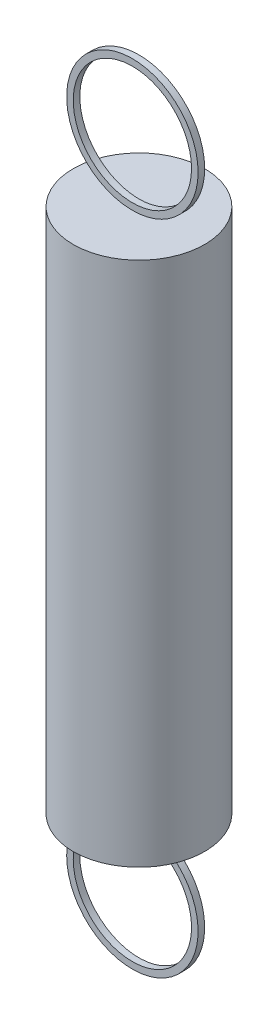
ISO-10303-21;
HEADER;
FILE_DESCRIPTION(('STEP AP214'),'2;1');
FILE_NAME('part.step','',(''),(''),'','','');
FILE_SCHEMA(('AUTOMOTIVE_DESIGN { 1 0 10303 214 1 1 1 1 }'));
ENDSEC;
DATA;
#1=APPLICATION_CONTEXT('core data for automotive mechanical design processes');
#2=APPLICATION_PROTOCOL_DEFINITION('international standard','automotive_design',2000,#1);
#3=PRODUCT_CONTEXT('',#1,'mechanical');
#4=PRODUCT('Part','Part','',(#3));
#5=PRODUCT_RELATED_PRODUCT_CATEGORY('part','',(#4));
#6=PRODUCT_DEFINITION_FORMATION('','',#4);
#7=PRODUCT_DEFINITION_CONTEXT('part definition',#1,'design');
#8=PRODUCT_DEFINITION('design','',#6,#7);
#9=PRODUCT_DEFINITION_SHAPE('','',#8);
#10=(LENGTH_UNIT() NAMED_UNIT(*) SI_UNIT(.MILLI.,.METRE.));
#11=(NAMED_UNIT(*) PLANE_ANGLE_UNIT() SI_UNIT($,.RADIAN.));
#12=(NAMED_UNIT(*) SI_UNIT($,.STERADIAN.) SOLID_ANGLE_UNIT());
#13=UNCERTAINTY_MEASURE_WITH_UNIT(LENGTH_MEASURE(1.E-05),#10,'distance_accuracy_value','');
#14=(GEOMETRIC_REPRESENTATION_CONTEXT(3) GLOBAL_UNCERTAINTY_ASSIGNED_CONTEXT((#13)) GLOBAL_UNIT_ASSIGNED_CONTEXT((#10,
#11,#12)) REPRESENTATION_CONTEXT('',''));
#15=CARTESIAN_POINT('',(0.,0.,0.));
#16=DIRECTION('',(0.,0.,1.));
#17=DIRECTION('',(1.,0.,0.));
#18=AXIS2_PLACEMENT_3D('',#15,#16,#17);
#19=CARTESIAN_POINT('',(0.,-5.,0.5));
#20=DIRECTION('',(0.,0.,-1.));
#21=DIRECTION('',(-1.,0.,0.));
#22=AXIS2_PLACEMENT_3D('',#19,#20,#21);
#23=PLANE('',#22);
#24=CARTESIAN_POINT('',(0.,-5.,0.5));
#25=DIRECTION('',(0.,0.,1.));
#26=DIRECTION('',(-1.,0.,0.));
#27=AXIS2_PLACEMENT_3D('',#24,#25,#26);
#28=CIRCLE('',#27,5.);
#29=CARTESIAN_POINT('',(-5.,-5.,0.5));
#30=VERTEX_POINT('',#29);
#31=EDGE_CURVE('E59',#30,#30,#28,.T.);
#32=ORIENTED_EDGE('',*,*,#31,.T.);
#33=EDGE_LOOP('',(#32));
#34=FACE_BOUND('',#33,.T.);
#35=CARTESIAN_POINT('',(0.,-5.,0.5));
#36=DIRECTION('',(0.,0.,1.));
#37=DIRECTION('',(-1.,0.,0.));
#38=AXIS2_PLACEMENT_3D('',#35,#36,#37);
#39=CIRCLE('',#38,4.5);
#40=CARTESIAN_POINT('',(-4.5,-5.,0.5));
#41=VERTEX_POINT('',#40);
#42=EDGE_CURVE('E50',#41,#41,#39,.T.);
#43=ORIENTED_EDGE('',*,*,#42,.F.);
#44=EDGE_LOOP('',(#43));
#45=FACE_BOUND('',#44,.T.);
#46=ADVANCED_FACE('F46',(#34,#45),#23,.F.);
#47=CARTESIAN_POINT('',(0.,-5.,0.));
#48=DIRECTION('',(0.,0.,-1.));
#49=DIRECTION('',(-1.,0.,0.));
#50=AXIS2_PLACEMENT_3D('',#47,#48,#49);
#51=PLANE('',#50);
#52=CARTESIAN_POINT('',(0.,-5.,0.));
#53=DIRECTION('',(0.,0.,1.));
#54=DIRECTION('',(-1.,0.,0.));
#55=AXIS2_PLACEMENT_3D('',#52,#53,#54);
#56=CIRCLE('',#55,5.);
#57=CARTESIAN_POINT('',(-5.,-5.,0.));
#58=VERTEX_POINT('',#57);
#59=EDGE_CURVE('E57',#58,#58,#56,.T.);
#60=ORIENTED_EDGE('',*,*,#59,.F.);
#61=EDGE_LOOP('',(#60));
#62=FACE_BOUND('',#61,.T.);
#63=CARTESIAN_POINT('',(0.,-5.,0.));
#64=DIRECTION('',(0.,0.,1.));
#65=DIRECTION('',(-1.,0.,0.));
#66=AXIS2_PLACEMENT_3D('',#63,#64,#65);
#67=CIRCLE('',#66,4.5);
#68=CARTESIAN_POINT('',(-4.5,-5.,0.));
#69=VERTEX_POINT('',#68);
#70=EDGE_CURVE('E11',#69,#69,#67,.T.);
#71=ORIENTED_EDGE('',*,*,#70,.T.);
#72=EDGE_LOOP('',(#71));
#73=FACE_BOUND('',#72,.T.);
#74=ADVANCED_FACE('F67',(#62,#73),#51,.T.);
#75=CARTESIAN_POINT('',(0.,-5.,0.5));
#76=DIRECTION('',(0.,0.,-1.));
#77=DIRECTION('',(-1.,0.,0.));
#78=AXIS2_PLACEMENT_3D('',#75,#76,#77);
#79=CYLINDRICAL_SURFACE('',#78,5.);
#80=ORIENTED_EDGE('',*,*,#31,.F.);
#81=EDGE_LOOP('',(#80));
#82=FACE_BOUND('',#81,.T.);
#83=ORIENTED_EDGE('',*,*,#59,.T.);
#84=EDGE_LOOP('',(#83));
#85=FACE_BOUND('',#84,.T.);
#86=ADVANCED_FACE('F65',(#82,#85),#79,.T.);
#87=CARTESIAN_POINT('',(0.,-5.,0.5));
#88=DIRECTION('',(0.,0.,-1.));
#89=DIRECTION('',(-1.,0.,0.));
#90=AXIS2_PLACEMENT_3D('',#87,#88,#89);
#91=CYLINDRICAL_SURFACE('',#90,4.5);
#92=ORIENTED_EDGE('',*,*,#42,.T.);
#93=EDGE_LOOP('',(#92));
#94=FACE_BOUND('',#93,.T.);
#95=ORIENTED_EDGE('',*,*,#70,.F.);
#96=EDGE_LOOP('',(#95));
#97=FACE_BOUND('',#96,.T.);
#98=ADVANCED_FACE('F48',(#94,#97),#91,.F.);
#99=CLOSED_SHELL('',(#46,#74,#86,#98));
#100=MANIFOLD_SOLID_BREP('B2',#99);
#101=CARTESIAN_POINT('',(0.,45.,0.5));
#102=DIRECTION('',(0.,0.,1.));
#103=DIRECTION('',(1.,0.,0.));
#104=AXIS2_PLACEMENT_3D('',#101,#102,#103);
#105=PLANE('',#104);
#106=CARTESIAN_POINT('',(0.,45.,0.5));
#107=DIRECTION('',(0.,0.,1.));
#108=DIRECTION('',(1.,0.,0.));
#109=AXIS2_PLACEMENT_3D('',#106,#107,#108);
#110=CIRCLE('',#109,5.);
#111=CARTESIAN_POINT('',(5.,45.,0.5));
#112=VERTEX_POINT('',#111);
#113=EDGE_CURVE('E45',#112,#112,#110,.T.);
#114=ORIENTED_EDGE('',*,*,#113,.T.);
#115=EDGE_LOOP('',(#114));
#116=FACE_BOUND('',#115,.T.);
#117=CARTESIAN_POINT('',(0.,45.,0.5));
#118=DIRECTION('',(0.,0.,1.));
#119=DIRECTION('',(1.,0.,0.));
#120=AXIS2_PLACEMENT_3D('',#117,#118,#119);
#121=CIRCLE('',#120,4.50000000000001);
#122=CARTESIAN_POINT('',(4.50000000000001,45.,0.5));
#123=VERTEX_POINT('',#122);
#124=EDGE_CURVE('E142',#123,#123,#121,.T.);
#125=ORIENTED_EDGE('',*,*,#124,.F.);
#126=EDGE_LOOP('',(#125));
#127=FACE_BOUND('',#126,.T.);
#128=ADVANCED_FACE('F131',(#116,#127),#105,.T.);
#129=CARTESIAN_POINT('',(0.,45.,0.));
#130=DIRECTION('',(0.,0.,1.));
#131=DIRECTION('',(1.,0.,0.));
#132=AXIS2_PLACEMENT_3D('',#129,#130,#131);
#133=PLANE('',#132);
#134=CARTESIAN_POINT('',(0.,45.,0.));
#135=DIRECTION('',(0.,0.,1.));
#136=DIRECTION('',(1.,0.,0.));
#137=AXIS2_PLACEMENT_3D('',#134,#135,#136);
#138=CIRCLE('',#137,5.);
#139=CARTESIAN_POINT('',(5.,45.,0.));
#140=VERTEX_POINT('',#139);
#141=EDGE_CURVE('E135',#140,#140,#138,.T.);
#142=ORIENTED_EDGE('',*,*,#141,.F.);
#143=EDGE_LOOP('',(#142));
#144=FACE_BOUND('',#143,.T.);
#145=CARTESIAN_POINT('',(0.,45.,0.));
#146=DIRECTION('',(0.,0.,1.));
#147=DIRECTION('',(1.,0.,0.));
#148=AXIS2_PLACEMENT_3D('',#145,#146,#147);
#149=CIRCLE('',#148,4.50000000000001);
#150=CARTESIAN_POINT('',(4.50000000000001,45.,0.));
#151=VERTEX_POINT('',#150);
#152=EDGE_CURVE('E144',#151,#151,#149,.T.);
#153=ORIENTED_EDGE('',*,*,#152,.T.);
#154=EDGE_LOOP('',(#153));
#155=FACE_BOUND('',#154,.T.);
#156=ADVANCED_FACE('F154',(#144,#155),#133,.F.);
#157=CARTESIAN_POINT('',(0.,45.,0.5));
#158=DIRECTION('',(0.,0.,-1.));
#159=DIRECTION('',(-1.,0.,0.));
#160=AXIS2_PLACEMENT_3D('',#157,#158,#159);
#161=CYLINDRICAL_SURFACE('',#160,5.);
#162=ORIENTED_EDGE('',*,*,#113,.F.);
#163=EDGE_LOOP('',(#162));
#164=FACE_BOUND('',#163,.T.);
#165=ORIENTED_EDGE('',*,*,#141,.T.);
#166=EDGE_LOOP('',(#165));
#167=FACE_BOUND('',#166,.T.);
#168=ADVANCED_FACE('F133',(#164,#167),#161,.T.);
#169=CARTESIAN_POINT('',(0.,45.,0.5));
#170=DIRECTION('',(0.,0.,-1.));
#171=DIRECTION('',(-1.,0.,0.));
#172=AXIS2_PLACEMENT_3D('',#169,#170,#171);
#173=CYLINDRICAL_SURFACE('',#172,4.50000000000001);
#174=ORIENTED_EDGE('',*,*,#124,.T.);
#175=EDGE_LOOP('',(#174));
#176=FACE_BOUND('',#175,.T.);
#177=ORIENTED_EDGE('',*,*,#152,.F.);
#178=EDGE_LOOP('',(#177));
#179=FACE_BOUND('',#178,.T.);
#180=ADVANCED_FACE('F150',(#176,#179),#173,.F.);
#181=CLOSED_SHELL('',(#128,#156,#168,#180));
#182=MANIFOLD_SOLID_BREP('B6',#181);
#183=CARTESIAN_POINT('',(0.,40.,0.));
#184=DIRECTION('',(0.,-1.,0.));
#185=DIRECTION('',(0.,0.,-1.));
#186=AXIS2_PLACEMENT_3D('',#183,#184,#185);
#187=CYLINDRICAL_SURFACE('',#186,5.);
#188=CARTESIAN_POINT('',(0.,40.,0.));
#189=DIRECTION('',(0.,1.,0.));
#190=DIRECTION('',(0.,0.,1.));
#191=AXIS2_PLACEMENT_3D('',#188,#189,#190);
#192=CIRCLE('',#191,5.);
#193=CARTESIAN_POINT('',(0.,40.,5.));
#194=VERTEX_POINT('',#193);
#195=EDGE_CURVE('E130',#194,#194,#192,.T.);
#196=ORIENTED_EDGE('',*,*,#195,.F.);
#197=EDGE_LOOP('',(#196));
#198=FACE_BOUND('',#197,.T.);
#199=CARTESIAN_POINT('',(0.,0.,0.));
#200=DIRECTION('',(0.,1.,0.));
#201=DIRECTION('',(0.,0.,1.));
#202=AXIS2_PLACEMENT_3D('',#199,#200,#201);
#203=CIRCLE('',#202,5.);
#204=CARTESIAN_POINT('',(0.,0.,5.));
#205=VERTEX_POINT('',#204);
#206=EDGE_CURVE('E212',#205,#205,#203,.T.);
#207=ORIENTED_EDGE('',*,*,#206,.T.);
#208=EDGE_LOOP('',(#207));
#209=FACE_BOUND('',#208,.T.);
#210=ADVANCED_FACE('F209',(#198,#209),#187,.T.);
#211=CARTESIAN_POINT('',(0.,40.,0.));
#212=DIRECTION('',(0.,1.,0.));
#213=DIRECTION('',(0.,0.,1.));
#214=AXIS2_PLACEMENT_3D('',#211,#212,#213);
#215=PLANE('',#214);
#216=ORIENTED_EDGE('',*,*,#195,.T.);
#217=EDGE_LOOP('',(#216));
#218=FACE_BOUND('',#217,.T.);
#219=ADVANCED_FACE('F224',(#218),#215,.T.);
#220=CARTESIAN_POINT('',(0.,0.,0.));
#221=DIRECTION('',(0.,1.,0.));
#222=DIRECTION('',(0.,0.,1.));
#223=AXIS2_PLACEMENT_3D('',#220,#221,#222);
#224=PLANE('',#223);
#225=ORIENTED_EDGE('',*,*,#206,.F.);
#226=EDGE_LOOP('',(#225));
#227=FACE_BOUND('',#226,.T.);
#228=ADVANCED_FACE('F222',(#227),#224,.F.);
#229=CLOSED_SHELL('',(#210,#219,#228));
#230=MANIFOLD_SOLID_BREP('B40',#229);
#231=ADVANCED_BREP_SHAPE_REPRESENTATION('',(#18,#100,#182,#230),#14);
#232=SHAPE_DEFINITION_REPRESENTATION(#9,#231);
ENDSEC;
END-ISO-10303-21;
